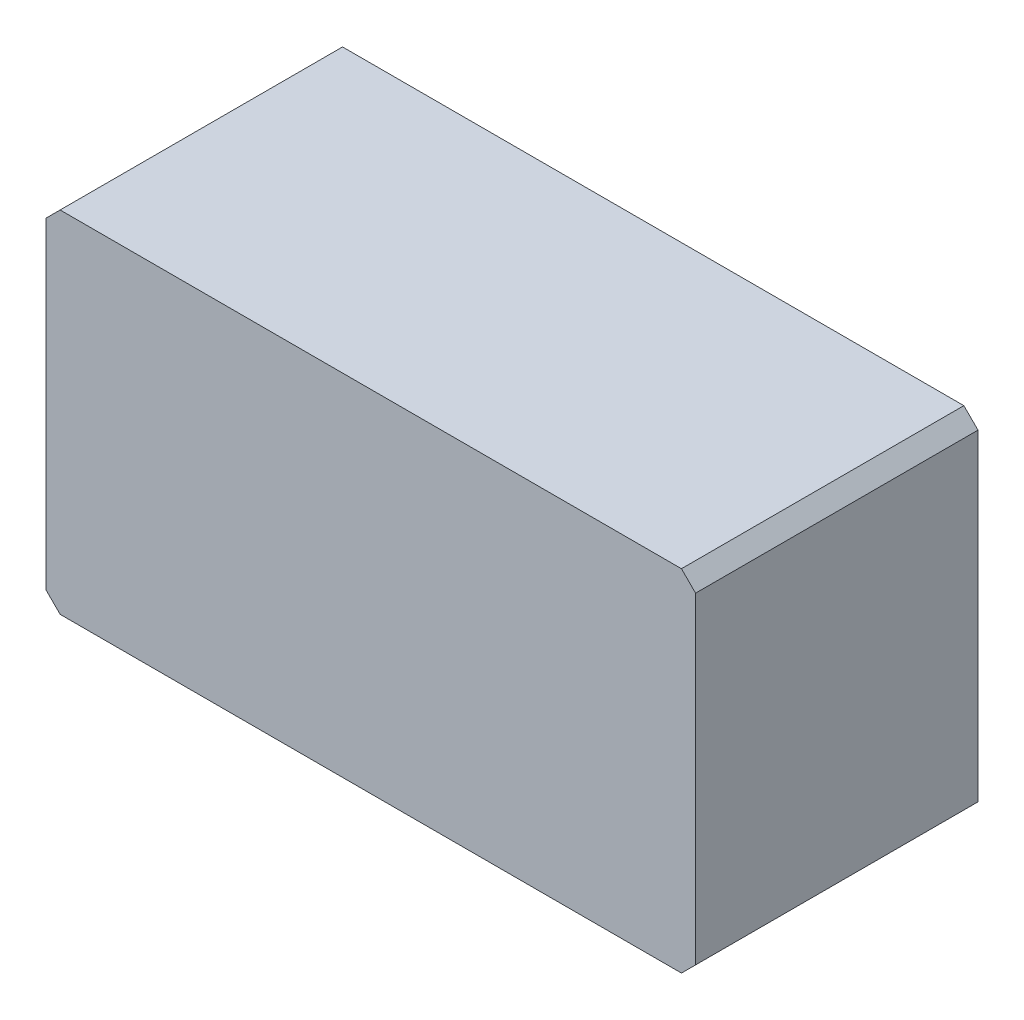
ISO-10303-21;
HEADER;
FILE_DESCRIPTION(('STEP AP214'),'2;1');
FILE_NAME('part.step','',(''),(''),'','','');
FILE_SCHEMA(('AUTOMOTIVE_DESIGN { 1 0 10303 214 1 1 1 1 }'));
ENDSEC;
DATA;
#1=APPLICATION_CONTEXT('core data for automotive mechanical design processes');
#2=APPLICATION_PROTOCOL_DEFINITION('international standard','automotive_design',2000,#1);
#3=PRODUCT_CONTEXT('',#1,'mechanical');
#4=PRODUCT('Part','Part','',(#3));
#5=PRODUCT_RELATED_PRODUCT_CATEGORY('part','',(#4));
#6=PRODUCT_DEFINITION_FORMATION('','',#4);
#7=PRODUCT_DEFINITION_CONTEXT('part definition',#1,'design');
#8=PRODUCT_DEFINITION('design','',#6,#7);
#9=PRODUCT_DEFINITION_SHAPE('','',#8);
#10=(LENGTH_UNIT() NAMED_UNIT(*) SI_UNIT(.MILLI.,.METRE.));
#11=(NAMED_UNIT(*) PLANE_ANGLE_UNIT() SI_UNIT($,.RADIAN.));
#12=(NAMED_UNIT(*) SI_UNIT($,.STERADIAN.) SOLID_ANGLE_UNIT());
#13=UNCERTAINTY_MEASURE_WITH_UNIT(LENGTH_MEASURE(1.E-05),#10,'distance_accuracy_value','');
#14=(GEOMETRIC_REPRESENTATION_CONTEXT(3) GLOBAL_UNCERTAINTY_ASSIGNED_CONTEXT((#13)) GLOBAL_UNIT_ASSIGNED_CONTEXT((#10,
#11,#12)) REPRESENTATION_CONTEXT('',''));
#15=CARTESIAN_POINT('',(0.,0.,0.));
#16=DIRECTION('',(0.,0.,1.));
#17=DIRECTION('',(1.,0.,0.));
#18=AXIS2_PLACEMENT_3D('',#15,#16,#17);
#19=CARTESIAN_POINT('',(-0.55,0.31,0.5));
#20=DIRECTION('',(0.,-1.,0.));
#21=DIRECTION('',(0.,0.,-1.));
#22=AXIS2_PLACEMENT_3D('',#19,#20,#21);
#23=PLANE('',#22);
#24=DIRECTION('',(-1.,0.,0.));
#25=VECTOR('',#24,1.);
#26=CARTESIAN_POINT('',(-0.55,0.31,0.));
#27=LINE('',#26,#25);
#28=CARTESIAN_POINT('',(0.55,0.31,0.));
#29=VERTEX_POINT('',#28);
#30=CARTESIAN_POINT('',(-0.55,0.31,0.));
#31=VERTEX_POINT('',#30);
#32=EDGE_CURVE('E130',#29,#31,#27,.T.);
#33=ORIENTED_EDGE('',*,*,#32,.T.);
#34=DIRECTION('',(0.,0.,-1.));
#35=VECTOR('',#34,1.);
#36=CARTESIAN_POINT('',(-0.55,0.31,0.5));
#37=LINE('',#36,#35);
#38=CARTESIAN_POINT('',(-0.55,0.31,0.5));
#39=VERTEX_POINT('',#38);
#40=EDGE_CURVE('E11',#39,#31,#37,.T.);
#41=ORIENTED_EDGE('',*,*,#40,.F.);
#42=DIRECTION('',(-1.,0.,0.));
#43=VECTOR('',#42,1.);
#44=CARTESIAN_POINT('',(-0.55,0.31,0.5));
#45=LINE('',#44,#43);
#46=CARTESIAN_POINT('',(0.55,0.31,0.5));
#47=VERTEX_POINT('',#46);
#48=EDGE_CURVE('E144',#47,#39,#45,.T.);
#49=ORIENTED_EDGE('',*,*,#48,.F.);
#50=DIRECTION('',(0.,0.,-1.));
#51=VECTOR('',#50,1.);
#52=CARTESIAN_POINT('',(0.55,0.31,0.5));
#53=LINE('',#52,#51);
#54=EDGE_CURVE('E126',#47,#29,#53,.T.);
#55=ORIENTED_EDGE('',*,*,#54,.T.);
#56=EDGE_LOOP('',(#33,#41,#49,#55));
#57=FACE_BOUND('',#56,.T.);
#58=ADVANCED_FACE('F34',(#57),#23,.F.);
#59=CARTESIAN_POINT('',(-0.575,0.285,0.5));
#60=DIRECTION('',(0.707106781186548,-0.707106781186547,0.));
#61=DIRECTION('',(0.707106781186547,0.707106781186548,0.));
#62=AXIS2_PLACEMENT_3D('',#59,#60,#61);
#63=PLANE('',#62);
#64=DIRECTION('',(-0.707106781186547,-0.707106781186548,0.));
#65=VECTOR('',#64,1.);
#66=CARTESIAN_POINT('',(-0.575,0.285,0.));
#67=LINE('',#66,#65);
#68=CARTESIAN_POINT('',(-0.575,0.285,0.));
#69=VERTEX_POINT('',#68);
#70=EDGE_CURVE('E133',#31,#69,#67,.T.);
#71=ORIENTED_EDGE('',*,*,#70,.T.);
#72=DIRECTION('',(0.,0.,-1.));
#73=VECTOR('',#72,1.);
#74=CARTESIAN_POINT('',(-0.575,0.285,0.5));
#75=LINE('',#74,#73);
#76=CARTESIAN_POINT('',(-0.575,0.285,0.5));
#77=VERTEX_POINT('',#76);
#78=EDGE_CURVE('E42',#77,#69,#75,.T.);
#79=ORIENTED_EDGE('',*,*,#78,.F.);
#80=DIRECTION('',(-0.707106781186547,-0.707106781186548,0.));
#81=VECTOR('',#80,1.);
#82=CARTESIAN_POINT('',(-0.575,0.285,0.5));
#83=LINE('',#82,#81);
#84=EDGE_CURVE('E93',#39,#77,#83,.T.);
#85=ORIENTED_EDGE('',*,*,#84,.F.);
#86=ORIENTED_EDGE('',*,*,#40,.T.);
#87=EDGE_LOOP('',(#71,#79,#85,#86));
#88=FACE_BOUND('',#87,.T.);
#89=ADVANCED_FACE('F179',(#88),#63,.F.);
#90=CARTESIAN_POINT('',(-0.575,-0.285,0.5));
#91=DIRECTION('',(1.,0.,0.));
#92=DIRECTION('',(0.,0.,-1.));
#93=AXIS2_PLACEMENT_3D('',#90,#91,#92);
#94=PLANE('',#93);
#95=DIRECTION('',(0.,-1.,0.));
#96=VECTOR('',#95,1.);
#97=CARTESIAN_POINT('',(-0.575,-0.285,0.));
#98=LINE('',#97,#96);
#99=CARTESIAN_POINT('',(-0.575,-0.285,0.));
#100=VERTEX_POINT('',#99);
#101=EDGE_CURVE('E135',#69,#100,#98,.T.);
#102=ORIENTED_EDGE('',*,*,#101,.T.);
#103=DIRECTION('',(0.,0.,-1.));
#104=VECTOR('',#103,1.);
#105=CARTESIAN_POINT('',(-0.575,-0.285,0.5));
#106=LINE('',#105,#104);
#107=CARTESIAN_POINT('',(-0.575,-0.285,0.5));
#108=VERTEX_POINT('',#107);
#109=EDGE_CURVE('E151',#108,#100,#106,.T.);
#110=ORIENTED_EDGE('',*,*,#109,.F.);
#111=DIRECTION('',(0.,-1.,0.));
#112=VECTOR('',#111,1.);
#113=CARTESIAN_POINT('',(-0.575,-0.285,0.5));
#114=LINE('',#113,#112);
#115=EDGE_CURVE('E159',#77,#108,#114,.T.);
#116=ORIENTED_EDGE('',*,*,#115,.F.);
#117=ORIENTED_EDGE('',*,*,#78,.T.);
#118=EDGE_LOOP('',(#102,#110,#116,#117));
#119=FACE_BOUND('',#118,.T.);
#120=ADVANCED_FACE('F157',(#119),#94,.F.);
#121=CARTESIAN_POINT('',(-0.55,-0.31,0.5));
#122=DIRECTION('',(0.707106781186548,0.707106781186547,0.));
#123=DIRECTION('',(-0.707106781186547,0.707106781186548,0.));
#124=AXIS2_PLACEMENT_3D('',#121,#122,#123);
#125=PLANE('',#124);
#126=DIRECTION('',(0.707106781186547,-0.707106781186548,0.));
#127=VECTOR('',#126,1.);
#128=CARTESIAN_POINT('',(-0.55,-0.31,0.));
#129=LINE('',#128,#127);
#130=CARTESIAN_POINT('',(-0.55,-0.31,0.));
#131=VERTEX_POINT('',#130);
#132=EDGE_CURVE('E137',#100,#131,#129,.T.);
#133=ORIENTED_EDGE('',*,*,#132,.T.);
#134=DIRECTION('',(0.,0.,-1.));
#135=VECTOR('',#134,1.);
#136=CARTESIAN_POINT('',(-0.55,-0.31,0.5));
#137=LINE('',#136,#135);
#138=CARTESIAN_POINT('',(-0.55,-0.31,0.5));
#139=VERTEX_POINT('',#138);
#140=EDGE_CURVE('E148',#139,#131,#137,.T.);
#141=ORIENTED_EDGE('',*,*,#140,.F.);
#142=DIRECTION('',(0.707106781186547,-0.707106781186548,0.));
#143=VECTOR('',#142,1.);
#144=CARTESIAN_POINT('',(-0.55,-0.31,0.5));
#145=LINE('',#144,#143);
#146=EDGE_CURVE('E171',#108,#139,#145,.T.);
#147=ORIENTED_EDGE('',*,*,#146,.F.);
#148=ORIENTED_EDGE('',*,*,#109,.T.);
#149=EDGE_LOOP('',(#133,#141,#147,#148));
#150=FACE_BOUND('',#149,.T.);
#151=ADVANCED_FACE('F167',(#150),#125,.F.);
#152=CARTESIAN_POINT('',(0.55,-0.31,0.5));
#153=DIRECTION('',(0.,1.,0.));
#154=DIRECTION('',(0.,0.,1.));
#155=AXIS2_PLACEMENT_3D('',#152,#153,#154);
#156=PLANE('',#155);
#157=DIRECTION('',(1.,0.,0.));
#158=VECTOR('',#157,1.);
#159=CARTESIAN_POINT('',(0.55,-0.31,0.));
#160=LINE('',#159,#158);
#161=CARTESIAN_POINT('',(0.55,-0.31,0.));
#162=VERTEX_POINT('',#161);
#163=EDGE_CURVE('E139',#131,#162,#160,.T.);
#164=ORIENTED_EDGE('',*,*,#163,.T.);
#165=DIRECTION('',(0.,0.,-1.));
#166=VECTOR('',#165,1.);
#167=CARTESIAN_POINT('',(0.55,-0.31,0.5));
#168=LINE('',#167,#166);
#169=CARTESIAN_POINT('',(0.55,-0.31,0.5));
#170=VERTEX_POINT('',#169);
#171=EDGE_CURVE('E121',#170,#162,#168,.T.);
#172=ORIENTED_EDGE('',*,*,#171,.F.);
#173=DIRECTION('',(1.,0.,0.));
#174=VECTOR('',#173,1.);
#175=CARTESIAN_POINT('',(0.55,-0.31,0.5));
#176=LINE('',#175,#174);
#177=EDGE_CURVE('E112',#139,#170,#176,.T.);
#178=ORIENTED_EDGE('',*,*,#177,.F.);
#179=ORIENTED_EDGE('',*,*,#140,.T.);
#180=EDGE_LOOP('',(#164,#172,#178,#179));
#181=FACE_BOUND('',#180,.T.);
#182=ADVANCED_FACE('F170',(#181),#156,.F.);
#183=CARTESIAN_POINT('',(0.575,-0.285,0.5));
#184=DIRECTION('',(-0.707106781186548,0.707106781186547,0.));
#185=DIRECTION('',(-0.707106781186547,-0.707106781186548,0.));
#186=AXIS2_PLACEMENT_3D('',#183,#184,#185);
#187=PLANE('',#186);
#188=DIRECTION('',(0.707106781186547,0.707106781186548,0.));
#189=VECTOR('',#188,1.);
#190=CARTESIAN_POINT('',(0.575,-0.285,0.));
#191=LINE('',#190,#189);
#192=CARTESIAN_POINT('',(0.575,-0.285,0.));
#193=VERTEX_POINT('',#192);
#194=EDGE_CURVE('E120',#162,#193,#191,.T.);
#195=ORIENTED_EDGE('',*,*,#194,.T.);
#196=DIRECTION('',(0.,0.,-1.));
#197=VECTOR('',#196,1.);
#198=CARTESIAN_POINT('',(0.575,-0.285,0.5));
#199=LINE('',#198,#197);
#200=CARTESIAN_POINT('',(0.575,-0.285,0.5));
#201=VERTEX_POINT('',#200);
#202=EDGE_CURVE('E117',#201,#193,#199,.T.);
#203=ORIENTED_EDGE('',*,*,#202,.F.);
#204=DIRECTION('',(0.707106781186547,0.707106781186548,0.));
#205=VECTOR('',#204,1.);
#206=CARTESIAN_POINT('',(0.575,-0.285,0.5));
#207=LINE('',#206,#205);
#208=EDGE_CURVE('E106',#170,#201,#207,.T.);
#209=ORIENTED_EDGE('',*,*,#208,.F.);
#210=ORIENTED_EDGE('',*,*,#171,.T.);
#211=EDGE_LOOP('',(#195,#203,#209,#210));
#212=FACE_BOUND('',#211,.T.);
#213=ADVANCED_FACE('F118',(#212),#187,.F.);
#214=CARTESIAN_POINT('',(0.575,0.285,0.5));
#215=DIRECTION('',(-1.,0.,0.));
#216=DIRECTION('',(0.,0.,1.));
#217=AXIS2_PLACEMENT_3D('',#214,#215,#216);
#218=PLANE('',#217);
#219=DIRECTION('',(0.,1.,0.));
#220=VECTOR('',#219,1.);
#221=CARTESIAN_POINT('',(0.575,0.285,0.));
#222=LINE('',#221,#220);
#223=CARTESIAN_POINT('',(0.575,0.285,0.));
#224=VERTEX_POINT('',#223);
#225=EDGE_CURVE('E79',#193,#224,#222,.T.);
#226=ORIENTED_EDGE('',*,*,#225,.T.);
#227=DIRECTION('',(0.,0.,-1.));
#228=VECTOR('',#227,1.);
#229=CARTESIAN_POINT('',(0.575,0.285,0.5));
#230=LINE('',#229,#228);
#231=CARTESIAN_POINT('',(0.575,0.285,0.5));
#232=VERTEX_POINT('',#231);
#233=EDGE_CURVE('E122',#232,#224,#230,.T.);
#234=ORIENTED_EDGE('',*,*,#233,.F.);
#235=DIRECTION('',(0.,1.,0.));
#236=VECTOR('',#235,1.);
#237=CARTESIAN_POINT('',(0.575,0.285,0.5));
#238=LINE('',#237,#236);
#239=EDGE_CURVE('E110',#201,#232,#238,.T.);
#240=ORIENTED_EDGE('',*,*,#239,.F.);
#241=ORIENTED_EDGE('',*,*,#202,.T.);
#242=EDGE_LOOP('',(#226,#234,#240,#241));
#243=FACE_BOUND('',#242,.T.);
#244=ADVANCED_FACE('F124',(#243),#218,.F.);
#245=CARTESIAN_POINT('',(0.55,0.31,0.5));
#246=DIRECTION('',(-0.707106781186548,-0.707106781186547,0.));
#247=DIRECTION('',(0.707106781186547,-0.707106781186548,0.));
#248=AXIS2_PLACEMENT_3D('',#245,#246,#247);
#249=PLANE('',#248);
#250=DIRECTION('',(-0.707106781186547,0.707106781186548,0.));
#251=VECTOR('',#250,1.);
#252=CARTESIAN_POINT('',(0.55,0.31,0.));
#253=LINE('',#252,#251);
#254=EDGE_CURVE('E85',#224,#29,#253,.T.);
#255=ORIENTED_EDGE('',*,*,#254,.T.);
#256=ORIENTED_EDGE('',*,*,#54,.F.);
#257=DIRECTION('',(-0.707106781186547,0.707106781186548,0.));
#258=VECTOR('',#257,1.);
#259=CARTESIAN_POINT('',(0.55,0.31,0.5));
#260=LINE('',#259,#258);
#261=EDGE_CURVE('E50',#232,#47,#260,.T.);
#262=ORIENTED_EDGE('',*,*,#261,.F.);
#263=ORIENTED_EDGE('',*,*,#233,.T.);
#264=EDGE_LOOP('',(#255,#256,#262,#263));
#265=FACE_BOUND('',#264,.T.);
#266=ADVANCED_FACE('F195',(#265),#249,.F.);
#267=CARTESIAN_POINT('',(0.,0.,0.5));
#268=DIRECTION('',(0.,0.,-1.));
#269=DIRECTION('',(-1.,0.,0.));
#270=AXIS2_PLACEMENT_3D('',#267,#268,#269);
#271=PLANE('',#270);
#272=ORIENTED_EDGE('',*,*,#48,.T.);
#273=ORIENTED_EDGE('',*,*,#84,.T.);
#274=ORIENTED_EDGE('',*,*,#115,.T.);
#275=ORIENTED_EDGE('',*,*,#146,.T.);
#276=ORIENTED_EDGE('',*,*,#177,.T.);
#277=ORIENTED_EDGE('',*,*,#208,.T.);
#278=ORIENTED_EDGE('',*,*,#239,.T.);
#279=ORIENTED_EDGE('',*,*,#261,.T.);
#280=EDGE_LOOP('',(#272,#273,#274,#275,#276,#277,#278,#279));
#281=FACE_BOUND('',#280,.T.);
#282=ADVANCED_FACE('F108',(#281),#271,.F.);
#283=CARTESIAN_POINT('',(0.,0.,0.));
#284=DIRECTION('',(0.,0.,-1.));
#285=DIRECTION('',(-1.,0.,0.));
#286=AXIS2_PLACEMENT_3D('',#283,#284,#285);
#287=PLANE('',#286);
#288=ORIENTED_EDGE('',*,*,#32,.F.);
#289=ORIENTED_EDGE('',*,*,#254,.F.);
#290=ORIENTED_EDGE('',*,*,#225,.F.);
#291=ORIENTED_EDGE('',*,*,#194,.F.);
#292=ORIENTED_EDGE('',*,*,#163,.F.);
#293=ORIENTED_EDGE('',*,*,#132,.F.);
#294=ORIENTED_EDGE('',*,*,#101,.F.);
#295=ORIENTED_EDGE('',*,*,#70,.F.);
#296=EDGE_LOOP('',(#288,#289,#290,#291,#292,#293,#294,#295));
#297=FACE_BOUND('',#296,.T.);
#298=ADVANCED_FACE('F163',(#297),#287,.T.);
#299=CLOSED_SHELL('',(#58,#89,#120,#151,#182,#213,#244,#266,#282,#298));
#300=MANIFOLD_SOLID_BREP('B2',#299);
#301=ADVANCED_BREP_SHAPE_REPRESENTATION('',(#18,#300),#14);
#302=SHAPE_DEFINITION_REPRESENTATION(#9,#301);
ENDSEC;
END-ISO-10303-21;
